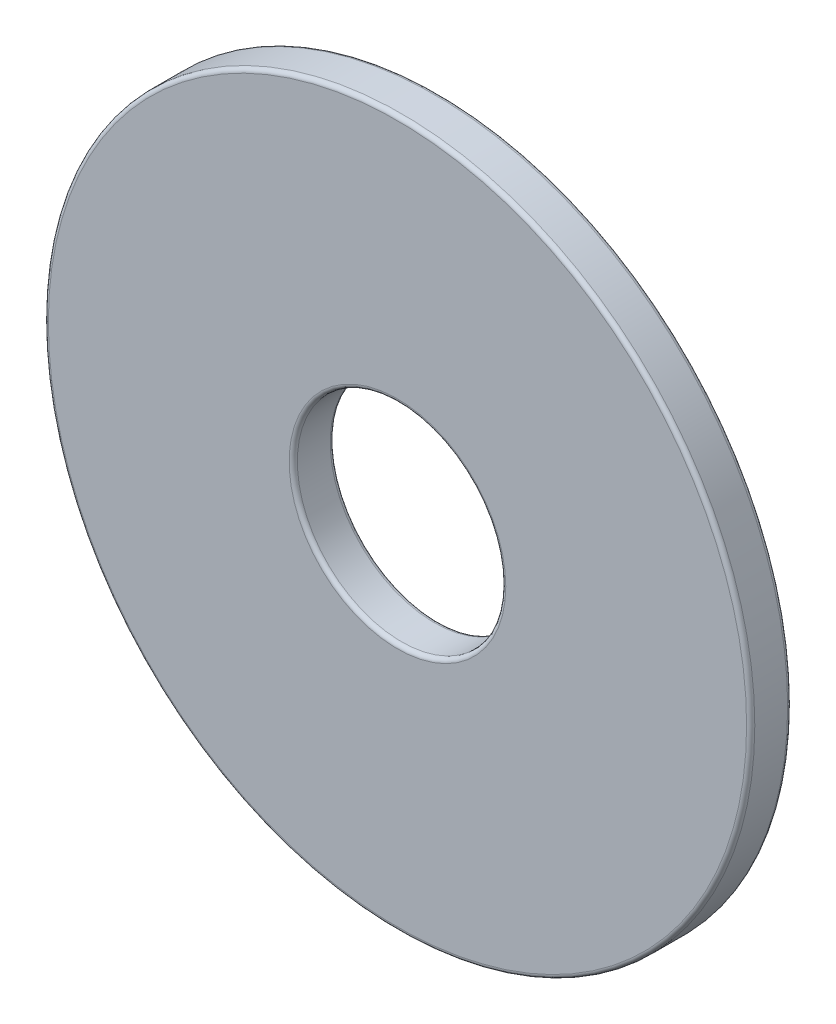
ISO-10303-21;
HEADER;
FILE_DESCRIPTION(('STEP AP214'),'2;1');
FILE_NAME('part.step','',(''),(''),'','','');
FILE_SCHEMA(('AUTOMOTIVE_DESIGN { 1 0 10303 214 1 1 1 1 }'));
ENDSEC;
DATA;
#1=APPLICATION_CONTEXT('core data for automotive mechanical design processes');
#2=APPLICATION_PROTOCOL_DEFINITION('international standard','automotive_design',2000,#1);
#3=PRODUCT_CONTEXT('',#1,'mechanical');
#4=PRODUCT('Part','Part','',(#3));
#5=PRODUCT_RELATED_PRODUCT_CATEGORY('part','',(#4));
#6=PRODUCT_DEFINITION_FORMATION('','',#4);
#7=PRODUCT_DEFINITION_CONTEXT('part definition',#1,'design');
#8=PRODUCT_DEFINITION('design','',#6,#7);
#9=PRODUCT_DEFINITION_SHAPE('','',#8);
#10=(LENGTH_UNIT() NAMED_UNIT(*) SI_UNIT(.MILLI.,.METRE.));
#11=(NAMED_UNIT(*) PLANE_ANGLE_UNIT() SI_UNIT($,.RADIAN.));
#12=(NAMED_UNIT(*) SI_UNIT($,.STERADIAN.) SOLID_ANGLE_UNIT());
#13=UNCERTAINTY_MEASURE_WITH_UNIT(LENGTH_MEASURE(1.E-05),#10,'distance_accuracy_value','');
#14=(GEOMETRIC_REPRESENTATION_CONTEXT(3) GLOBAL_UNCERTAINTY_ASSIGNED_CONTEXT((#13)) GLOBAL_UNIT_ASSIGNED_CONTEXT((#10,
#11,#12)) REPRESENTATION_CONTEXT('',''));
#15=CARTESIAN_POINT('',(0.,0.,0.));
#16=DIRECTION('',(0.,0.,1.));
#17=DIRECTION('',(1.,0.,0.));
#18=AXIS2_PLACEMENT_3D('',#15,#16,#17);
#19=CARTESIAN_POINT('',(0.,0.,-0.508000000000003));
#20=DIRECTION('',(0.,0.,1.));
#21=DIRECTION('',(1.,0.,0.));
#22=AXIS2_PLACEMENT_3D('',#19,#20,#21);
#23=CYLINDRICAL_SURFACE('',#22,8.7376);
#24=CARTESIAN_POINT('',(0.,0.,0.406400000000003));
#25=DIRECTION('',(0.,0.,1.));
#26=DIRECTION('',(1.,0.,0.));
#27=AXIS2_PLACEMENT_3D('',#24,#25,#26);
#28=CIRCLE('',#27,8.7376);
#29=CARTESIAN_POINT('',(8.7376,0.,0.406400000000003));
#30=VERTEX_POINT('',#29);
#31=EDGE_CURVE('E10',#30,#30,#28,.F.);
#32=ORIENTED_EDGE('',*,*,#31,.T.);
#33=EDGE_LOOP('',(#32));
#34=FACE_BOUND('',#33,.T.);
#35=CARTESIAN_POINT('',(0.,0.,-0.406400000000003));
#36=DIRECTION('',(0.,0.,1.));
#37=DIRECTION('',(1.,0.,0.));
#38=AXIS2_PLACEMENT_3D('',#35,#36,#37);
#39=CIRCLE('',#38,8.7376);
#40=CARTESIAN_POINT('',(8.7376,0.,-0.406400000000003));
#41=VERTEX_POINT('',#40);
#42=EDGE_CURVE('E43',#41,#41,#39,.T.);
#43=ORIENTED_EDGE('',*,*,#42,.T.);
#44=EDGE_LOOP('',(#43));
#45=FACE_BOUND('',#44,.T.);
#46=ADVANCED_FACE('F36',(#34,#45),#23,.T.);
#47=CARTESIAN_POINT('',(0.,0.,-0.508000000000003));
#48=DIRECTION('',(0.,0.,1.));
#49=DIRECTION('',(1.,0.,0.));
#50=AXIS2_PLACEMENT_3D('',#47,#48,#49);
#51=PLANE('',#50);
#52=CARTESIAN_POINT('',(0.,0.,-0.508000000000003));
#53=DIRECTION('',(0.,0.,1.));
#54=DIRECTION('',(1.,0.,0.));
#55=AXIS2_PLACEMENT_3D('',#52,#53,#54);
#56=CIRCLE('',#55,2.6797);
#57=CARTESIAN_POINT('',(2.6797,0.,-0.508000000000003));
#58=VERTEX_POINT('',#57);
#59=EDGE_CURVE('E47',#58,#58,#56,.T.);
#60=ORIENTED_EDGE('',*,*,#59,.T.);
#61=EDGE_LOOP('',(#60));
#62=FACE_BOUND('',#61,.T.);
#63=CARTESIAN_POINT('',(0.,0.,-0.508000000000003));
#64=DIRECTION('',(0.,0.,1.));
#65=DIRECTION('',(1.,0.,0.));
#66=AXIS2_PLACEMENT_3D('',#63,#64,#65);
#67=CIRCLE('',#66,8.636);
#68=CARTESIAN_POINT('',(8.636,0.,-0.508000000000003));
#69=VERTEX_POINT('',#68);
#70=EDGE_CURVE('E51',#69,#69,#67,.F.);
#71=ORIENTED_EDGE('',*,*,#70,.T.);
#72=EDGE_LOOP('',(#71));
#73=FACE_BOUND('',#72,.T.);
#74=ADVANCED_FACE('F79',(#62,#73),#51,.F.);
#75=CARTESIAN_POINT('',(0.,0.,0.508000000000003));
#76=DIRECTION('',(0.,0.,1.));
#77=DIRECTION('',(1.,0.,0.));
#78=AXIS2_PLACEMENT_3D('',#75,#76,#77);
#79=PLANE('',#78);
#80=CARTESIAN_POINT('',(0.,0.,0.508000000000003));
#81=DIRECTION('',(0.,0.,1.));
#82=DIRECTION('',(1.,0.,0.));
#83=AXIS2_PLACEMENT_3D('',#80,#81,#82);
#84=CIRCLE('',#83,2.6797);
#85=CARTESIAN_POINT('',(2.6797,0.,0.508000000000003));
#86=VERTEX_POINT('',#85);
#87=EDGE_CURVE('E56',#86,#86,#84,.F.);
#88=ORIENTED_EDGE('',*,*,#87,.T.);
#89=EDGE_LOOP('',(#88));
#90=FACE_BOUND('',#89,.T.);
#91=CARTESIAN_POINT('',(0.,0.,0.508000000000003));
#92=DIRECTION('',(0.,0.,1.));
#93=DIRECTION('',(1.,0.,0.));
#94=AXIS2_PLACEMENT_3D('',#91,#92,#93);
#95=CIRCLE('',#94,8.636);
#96=CARTESIAN_POINT('',(8.636,0.,0.508000000000003));
#97=VERTEX_POINT('',#96);
#98=EDGE_CURVE('E59',#97,#97,#95,.T.);
#99=ORIENTED_EDGE('',*,*,#98,.T.);
#100=EDGE_LOOP('',(#99));
#101=FACE_BOUND('',#100,.T.);
#102=ADVANCED_FACE('F82',(#90,#101),#79,.T.);
#103=CARTESIAN_POINT('',(0.,0.,-0.508000000000003));
#104=DIRECTION('',(0.,0.,1.));
#105=DIRECTION('',(1.,0.,0.));
#106=AXIS2_PLACEMENT_3D('',#103,#104,#105);
#107=CYLINDRICAL_SURFACE('',#106,2.5781);
#108=CARTESIAN_POINT('',(0.,0.,0.406400000000003));
#109=DIRECTION('',(0.,0.,1.));
#110=DIRECTION('',(1.,0.,0.));
#111=AXIS2_PLACEMENT_3D('',#108,#109,#110);
#112=CIRCLE('',#111,2.5781);
#113=CARTESIAN_POINT('',(2.5781,0.,0.406400000000003));
#114=VERTEX_POINT('',#113);
#115=EDGE_CURVE('E62',#114,#114,#112,.T.);
#116=ORIENTED_EDGE('',*,*,#115,.T.);
#117=EDGE_LOOP('',(#116));
#118=FACE_BOUND('',#117,.T.);
#119=CARTESIAN_POINT('',(0.,0.,-0.406400000000003));
#120=DIRECTION('',(0.,0.,1.));
#121=DIRECTION('',(1.,0.,0.));
#122=AXIS2_PLACEMENT_3D('',#119,#120,#121);
#123=CIRCLE('',#122,2.5781);
#124=CARTESIAN_POINT('',(2.5781,0.,-0.406400000000003));
#125=VERTEX_POINT('',#124);
#126=EDGE_CURVE('E65',#125,#125,#123,.F.);
#127=ORIENTED_EDGE('',*,*,#126,.T.);
#128=EDGE_LOOP('',(#127));
#129=FACE_BOUND('',#128,.T.);
#130=ADVANCED_FACE('F69',(#118,#129),#107,.F.);
#131=CARTESIAN_POINT('',(0.,0.,0.406400000000003));
#132=DIRECTION('',(0.,0.,1.));
#133=DIRECTION('',(1.,0.,0.));
#134=AXIS2_PLACEMENT_3D('',#131,#132,#133);
#135=TOROIDAL_SURFACE('',#134,2.6797,0.1016);
#136=ORIENTED_EDGE('',*,*,#87,.F.);
#137=EDGE_LOOP('',(#136));
#138=FACE_BOUND('',#137,.T.);
#139=ORIENTED_EDGE('',*,*,#115,.F.);
#140=EDGE_LOOP('',(#139));
#141=FACE_BOUND('',#140,.T.);
#142=ADVANCED_FACE('F75',(#138,#141),#135,.T.);
#143=CARTESIAN_POINT('',(0.,0.,-0.406400000000003));
#144=DIRECTION('',(0.,0.,1.));
#145=DIRECTION('',(1.,0.,0.));
#146=AXIS2_PLACEMENT_3D('',#143,#144,#145);
#147=TOROIDAL_SURFACE('',#146,2.6797,0.1016);
#148=ORIENTED_EDGE('',*,*,#126,.F.);
#149=EDGE_LOOP('',(#148));
#150=FACE_BOUND('',#149,.T.);
#151=ORIENTED_EDGE('',*,*,#59,.F.);
#152=EDGE_LOOP('',(#151));
#153=FACE_BOUND('',#152,.T.);
#154=ADVANCED_FACE('F71',(#150,#153),#147,.T.);
#155=CARTESIAN_POINT('',(0.,0.,0.406400000000003));
#156=DIRECTION('',(0.,0.,1.));
#157=DIRECTION('',(1.,0.,0.));
#158=AXIS2_PLACEMENT_3D('',#155,#156,#157);
#159=TOROIDAL_SURFACE('',#158,8.636,0.1016);
#160=ORIENTED_EDGE('',*,*,#31,.F.);
#161=EDGE_LOOP('',(#160));
#162=FACE_BOUND('',#161,.T.);
#163=ORIENTED_EDGE('',*,*,#98,.F.);
#164=EDGE_LOOP('',(#163));
#165=FACE_BOUND('',#164,.T.);
#166=ADVANCED_FACE('F74',(#162,#165),#159,.T.);
#167=CARTESIAN_POINT('',(0.,0.,-0.406400000000003));
#168=DIRECTION('',(0.,0.,1.));
#169=DIRECTION('',(1.,0.,0.));
#170=AXIS2_PLACEMENT_3D('',#167,#168,#169);
#171=TOROIDAL_SURFACE('',#170,8.636,0.1016);
#172=ORIENTED_EDGE('',*,*,#70,.F.);
#173=EDGE_LOOP('',(#172));
#174=FACE_BOUND('',#173,.T.);
#175=ORIENTED_EDGE('',*,*,#42,.F.);
#176=EDGE_LOOP('',(#175));
#177=FACE_BOUND('',#176,.T.);
#178=ADVANCED_FACE('F38',(#174,#177),#171,.T.);
#179=CLOSED_SHELL('',(#46,#74,#102,#130,#142,#154,#166,#178));
#180=MANIFOLD_SOLID_BREP('B2',#179);
#181=ADVANCED_BREP_SHAPE_REPRESENTATION('',(#18,#180),#14);
#182=SHAPE_DEFINITION_REPRESENTATION(#9,#181);
ENDSEC;
END-ISO-10303-21;
